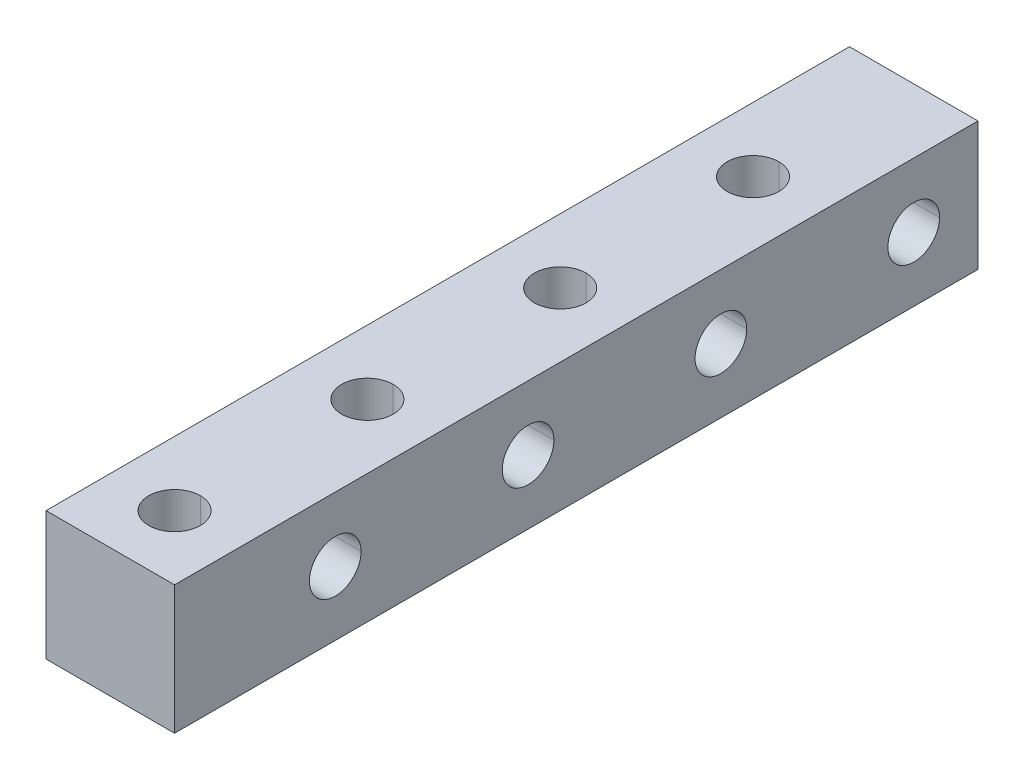
ISO-10303-21;
HEADER;
FILE_DESCRIPTION(('STEP AP214'),'2;1');
FILE_NAME('part.step','',(''),(''),'','','');
FILE_SCHEMA(('AUTOMOTIVE_DESIGN { 1 0 10303 214 1 1 1 1 }'));
ENDSEC;
DATA;
#1=APPLICATION_CONTEXT('core data for automotive mechanical design processes');
#2=APPLICATION_PROTOCOL_DEFINITION('international standard','automotive_design',2000,#1);
#3=PRODUCT_CONTEXT('',#1,'mechanical');
#4=PRODUCT('Part','Part','',(#3));
#5=PRODUCT_RELATED_PRODUCT_CATEGORY('part','',(#4));
#6=PRODUCT_DEFINITION_FORMATION('','',#4);
#7=PRODUCT_DEFINITION_CONTEXT('part definition',#1,'design');
#8=PRODUCT_DEFINITION('design','',#6,#7);
#9=PRODUCT_DEFINITION_SHAPE('','',#8);
#10=(LENGTH_UNIT() NAMED_UNIT(*) SI_UNIT(.MILLI.,.METRE.));
#11=(NAMED_UNIT(*) PLANE_ANGLE_UNIT() SI_UNIT($,.RADIAN.));
#12=(NAMED_UNIT(*) SI_UNIT($,.STERADIAN.) SOLID_ANGLE_UNIT());
#13=UNCERTAINTY_MEASURE_WITH_UNIT(LENGTH_MEASURE(1.E-05),#10,'distance_accuracy_value','');
#14=(GEOMETRIC_REPRESENTATION_CONTEXT(3) GLOBAL_UNCERTAINTY_ASSIGNED_CONTEXT((#13)) GLOBAL_UNIT_ASSIGNED_CONTEXT((#10,
#11,#12)) REPRESENTATION_CONTEXT('',''));
#15=CARTESIAN_POINT('',(0.,0.,0.));
#16=DIRECTION('',(0.,0.,1.));
#17=DIRECTION('',(1.,0.,0.));
#18=AXIS2_PLACEMENT_3D('',#15,#16,#17);
#19=CARTESIAN_POINT('',(-6.35,6.35,-79.375));
#20=DIRECTION('',(0.,0.,1.));
#21=DIRECTION('',(1.,0.,0.));
#22=AXIS2_PLACEMENT_3D('',#19,#20,#21);
#23=PLANE('',#22);
#24=DIRECTION('',(0.,-1.,0.));
#25=VECTOR('',#24,1.);
#26=CARTESIAN_POINT('',(6.35,6.35,-79.375));
#27=LINE('',#26,#25);
#28=CARTESIAN_POINT('',(6.35,6.35,-79.375));
#29=VERTEX_POINT('',#28);
#30=CARTESIAN_POINT('',(6.35,-6.35,-79.375));
#31=VERTEX_POINT('',#30);
#32=EDGE_CURVE('E287',#29,#31,#27,.T.);
#33=ORIENTED_EDGE('',*,*,#32,.T.);
#34=DIRECTION('',(1.,0.,0.));
#35=VECTOR('',#34,1.);
#36=CARTESIAN_POINT('',(-6.35,-6.35,-79.375));
#37=LINE('',#36,#35);
#38=CARTESIAN_POINT('',(-6.35,-6.35,-79.375));
#39=VERTEX_POINT('',#38);
#40=EDGE_CURVE('E254',#39,#31,#37,.T.);
#41=ORIENTED_EDGE('',*,*,#40,.F.);
#42=DIRECTION('',(0.,-1.,0.));
#43=VECTOR('',#42,1.);
#44=CARTESIAN_POINT('',(-6.35,6.35,-79.375));
#45=LINE('',#44,#43);
#46=CARTESIAN_POINT('',(-6.35,6.35,-79.375));
#47=VERTEX_POINT('',#46);
#48=EDGE_CURVE('E391',#47,#39,#45,.T.);
#49=ORIENTED_EDGE('',*,*,#48,.F.);
#50=DIRECTION('',(1.,0.,0.));
#51=VECTOR('',#50,1.);
#52=CARTESIAN_POINT('',(-6.35,6.35,-79.375));
#53=LINE('',#52,#51);
#54=EDGE_CURVE('E327',#47,#29,#53,.T.);
#55=ORIENTED_EDGE('',*,*,#54,.T.);
#56=EDGE_LOOP('',(#33,#41,#49,#55));
#57=FACE_BOUND('',#56,.T.);
#58=ADVANCED_FACE('F16',(#57),#23,.F.);
#59=CARTESIAN_POINT('',(6.35,0.,-73.025));
#60=DIRECTION('',(1.,0.,0.));
#61=DIRECTION('',(0.,0.,-1.));
#62=AXIS2_PLACEMENT_3D('',#59,#60,#61);
#63=CYLINDRICAL_SURFACE('',#62,2.5527);
#64=DIRECTION('',(1.,0.,0.));
#65=VECTOR('',#64,1.);
#66=CARTESIAN_POINT('',(6.35,0.,-70.4723));
#67=LINE('',#66,#65);
#68=CARTESIAN_POINT('',(-6.35,0.,-70.4723));
#69=VERTEX_POINT('',#68);
#70=CARTESIAN_POINT('',(6.35,0.,-70.4723));
#71=VERTEX_POINT('',#70);
#72=EDGE_CURVE('E250',#69,#71,#67,.T.);
#73=ORIENTED_EDGE('',*,*,#72,.F.);
#74=CARTESIAN_POINT('',(-6.35,0.,-73.025));
#75=DIRECTION('',(1.,0.,0.));
#76=DIRECTION('',(0.,0.,-1.));
#77=AXIS2_PLACEMENT_3D('',#74,#75,#76);
#78=CIRCLE('',#77,2.5527);
#79=CARTESIAN_POINT('',(-6.35,0.,-75.5777));
#80=VERTEX_POINT('',#79);
#81=EDGE_CURVE('E356',#80,#69,#78,.T.);
#82=ORIENTED_EDGE('',*,*,#81,.F.);
#83=DIRECTION('',(1.,0.,0.));
#84=VECTOR('',#83,1.);
#85=CARTESIAN_POINT('',(6.35,0.,-75.5777));
#86=LINE('',#85,#84);
#87=CARTESIAN_POINT('',(6.35,0.,-75.5777));
#88=VERTEX_POINT('',#87);
#89=EDGE_CURVE('E249',#80,#88,#86,.T.);
#90=ORIENTED_EDGE('',*,*,#89,.T.);
#91=CARTESIAN_POINT('',(6.35,0.,-73.025));
#92=DIRECTION('',(1.,0.,0.));
#93=DIRECTION('',(0.,0.,-1.));
#94=AXIS2_PLACEMENT_3D('',#91,#92,#93);
#95=CIRCLE('',#94,2.5527);
#96=EDGE_CURVE('E339',#88,#71,#95,.T.);
#97=ORIENTED_EDGE('',*,*,#96,.T.);
#98=EDGE_LOOP('',(#73,#82,#90,#97));
#99=FACE_BOUND('',#98,.T.);
#100=ADVANCED_FACE('F676',(#99),#63,.F.);
#101=CARTESIAN_POINT('',(6.35,0.,-53.975));
#102=DIRECTION('',(1.,0.,0.));
#103=DIRECTION('',(0.,0.,-1.));
#104=AXIS2_PLACEMENT_3D('',#101,#102,#103);
#105=CYLINDRICAL_SURFACE('',#104,2.5527);
#106=DIRECTION('',(1.,0.,0.));
#107=VECTOR('',#106,1.);
#108=CARTESIAN_POINT('',(6.35,0.,-51.4223));
#109=LINE('',#108,#107);
#110=CARTESIAN_POINT('',(-6.35,0.,-51.4223));
#111=VERTEX_POINT('',#110);
#112=CARTESIAN_POINT('',(6.35,0.,-51.4223));
#113=VERTEX_POINT('',#112);
#114=EDGE_CURVE('E241',#111,#113,#109,.T.);
#115=ORIENTED_EDGE('',*,*,#114,.F.);
#116=CARTESIAN_POINT('',(-6.35,0.,-53.975));
#117=DIRECTION('',(1.,0.,0.));
#118=DIRECTION('',(0.,0.,-1.));
#119=AXIS2_PLACEMENT_3D('',#116,#117,#118);
#120=CIRCLE('',#119,2.5527);
#121=CARTESIAN_POINT('',(-6.35,0.,-56.5277));
#122=VERTEX_POINT('',#121);
#123=EDGE_CURVE('E353',#122,#111,#120,.T.);
#124=ORIENTED_EDGE('',*,*,#123,.F.);
#125=DIRECTION('',(1.,0.,0.));
#126=VECTOR('',#125,1.);
#127=CARTESIAN_POINT('',(6.35,0.,-56.5277));
#128=LINE('',#127,#126);
#129=CARTESIAN_POINT('',(6.35,0.,-56.5277));
#130=VERTEX_POINT('',#129);
#131=EDGE_CURVE('E240',#122,#130,#128,.T.);
#132=ORIENTED_EDGE('',*,*,#131,.T.);
#133=CARTESIAN_POINT('',(6.35,0.,-53.975));
#134=DIRECTION('',(1.,0.,0.));
#135=DIRECTION('',(0.,0.,-1.));
#136=AXIS2_PLACEMENT_3D('',#133,#134,#135);
#137=CIRCLE('',#136,2.5527);
#138=EDGE_CURVE('E204',#130,#113,#137,.T.);
#139=ORIENTED_EDGE('',*,*,#138,.T.);
#140=EDGE_LOOP('',(#115,#124,#132,#139));
#141=FACE_BOUND('',#140,.T.);
#142=ADVANCED_FACE('F672',(#141),#105,.F.);
#143=CARTESIAN_POINT('',(6.35,0.,-34.925));
#144=DIRECTION('',(1.,0.,0.));
#145=DIRECTION('',(0.,0.,-1.));
#146=AXIS2_PLACEMENT_3D('',#143,#144,#145);
#147=CYLINDRICAL_SURFACE('',#146,2.5527);
#148=DIRECTION('',(1.,0.,0.));
#149=VECTOR('',#148,1.);
#150=CARTESIAN_POINT('',(6.35,0.,-32.3723));
#151=LINE('',#150,#149);
#152=CARTESIAN_POINT('',(-6.35,0.,-32.3723));
#153=VERTEX_POINT('',#152);
#154=CARTESIAN_POINT('',(6.35,0.,-32.3723));
#155=VERTEX_POINT('',#154);
#156=EDGE_CURVE('E217',#153,#155,#151,.T.);
#157=ORIENTED_EDGE('',*,*,#156,.F.);
#158=CARTESIAN_POINT('',(-6.35,0.,-34.925));
#159=DIRECTION('',(1.,0.,0.));
#160=DIRECTION('',(0.,0.,-1.));
#161=AXIS2_PLACEMENT_3D('',#158,#159,#160);
#162=CIRCLE('',#161,2.5527);
#163=CARTESIAN_POINT('',(-6.35,0.,-37.4777));
#164=VERTEX_POINT('',#163);
#165=EDGE_CURVE('E209',#164,#153,#162,.T.);
#166=ORIENTED_EDGE('',*,*,#165,.F.);
#167=DIRECTION('',(1.,0.,0.));
#168=VECTOR('',#167,1.);
#169=CARTESIAN_POINT('',(6.35,0.,-37.4777));
#170=LINE('',#169,#168);
#171=CARTESIAN_POINT('',(6.35,0.,-37.4777));
#172=VERTEX_POINT('',#171);
#173=EDGE_CURVE('E207',#164,#172,#170,.T.);
#174=ORIENTED_EDGE('',*,*,#173,.T.);
#175=CARTESIAN_POINT('',(6.35,0.,-34.925));
#176=DIRECTION('',(1.,0.,0.));
#177=DIRECTION('',(0.,0.,-1.));
#178=AXIS2_PLACEMENT_3D('',#175,#176,#177);
#179=CIRCLE('',#178,2.5527);
#180=EDGE_CURVE('E27',#172,#155,#179,.T.);
#181=ORIENTED_EDGE('',*,*,#180,.T.);
#182=EDGE_LOOP('',(#157,#166,#174,#181));
#183=FACE_BOUND('',#182,.T.);
#184=ADVANCED_FACE('F208',(#183),#147,.F.);
#185=CARTESIAN_POINT('',(0.,6.35,-63.5));
#186=DIRECTION('',(0.,1.,0.));
#187=DIRECTION('',(0.,0.,1.));
#188=AXIS2_PLACEMENT_3D('',#185,#186,#187);
#189=CYLINDRICAL_SURFACE('',#188,2.5527);
#190=DIRECTION('',(0.,1.,0.));
#191=VECTOR('',#190,1.);
#192=CARTESIAN_POINT('',(0.,6.35,-66.0527));
#193=LINE('',#192,#191);
#194=CARTESIAN_POINT('',(0.,-6.35,-66.0527));
#195=VERTEX_POINT('',#194);
#196=CARTESIAN_POINT('',(0.,6.35,-66.0527));
#197=VERTEX_POINT('',#196);
#198=EDGE_CURVE('E368',#195,#197,#193,.T.);
#199=ORIENTED_EDGE('',*,*,#198,.F.);
#200=CARTESIAN_POINT('',(0.,-6.35,-63.5));
#201=DIRECTION('',(0.,1.,0.));
#202=DIRECTION('',(0.,0.,1.));
#203=AXIS2_PLACEMENT_3D('',#200,#201,#202);
#204=CIRCLE('',#203,2.5527);
#205=CARTESIAN_POINT('',(0.,-6.35,-60.9473));
#206=VERTEX_POINT('',#205);
#207=EDGE_CURVE('E313',#206,#195,#204,.T.);
#208=ORIENTED_EDGE('',*,*,#207,.F.);
#209=DIRECTION('',(0.,1.,0.));
#210=VECTOR('',#209,1.);
#211=CARTESIAN_POINT('',(0.,6.35,-60.9473));
#212=LINE('',#211,#210);
#213=CARTESIAN_POINT('',(0.,6.35,-60.9473));
#214=VERTEX_POINT('',#213);
#215=EDGE_CURVE('E20',#206,#214,#212,.T.);
#216=ORIENTED_EDGE('',*,*,#215,.T.);
#217=CARTESIAN_POINT('',(0.,6.35,-63.5));
#218=DIRECTION('',(0.,1.,0.));
#219=DIRECTION('',(0.,0.,1.));
#220=AXIS2_PLACEMENT_3D('',#217,#218,#219);
#221=CIRCLE('',#220,2.5527);
#222=EDGE_CURVE('E306',#214,#197,#221,.T.);
#223=ORIENTED_EDGE('',*,*,#222,.T.);
#224=EDGE_LOOP('',(#199,#208,#216,#223));
#225=FACE_BOUND('',#224,.T.);
#226=ADVANCED_FACE('F457',(#225),#189,.F.);
#227=CARTESIAN_POINT('',(0.,6.35,-44.45));
#228=DIRECTION('',(0.,1.,0.));
#229=DIRECTION('',(0.,0.,1.));
#230=AXIS2_PLACEMENT_3D('',#227,#228,#229);
#231=CYLINDRICAL_SURFACE('',#230,2.5527);
#232=DIRECTION('',(0.,1.,0.));
#233=VECTOR('',#232,1.);
#234=CARTESIAN_POINT('',(0.,6.35,-47.0027));
#235=LINE('',#234,#233);
#236=CARTESIAN_POINT('',(0.,-6.35,-47.0027));
#237=VERTEX_POINT('',#236);
#238=CARTESIAN_POINT('',(0.,6.35,-47.0027));
#239=VERTEX_POINT('',#238);
#240=EDGE_CURVE('E276',#237,#239,#235,.T.);
#241=ORIENTED_EDGE('',*,*,#240,.F.);
#242=CARTESIAN_POINT('',(0.,-6.35,-44.45));
#243=DIRECTION('',(0.,1.,0.));
#244=DIRECTION('',(0.,0.,1.));
#245=AXIS2_PLACEMENT_3D('',#242,#243,#244);
#246=CIRCLE('',#245,2.5527);
#247=CARTESIAN_POINT('',(0.,-6.35,-41.8973));
#248=VERTEX_POINT('',#247);
#249=EDGE_CURVE('E312',#248,#237,#246,.T.);
#250=ORIENTED_EDGE('',*,*,#249,.F.);
#251=DIRECTION('',(0.,1.,0.));
#252=VECTOR('',#251,1.);
#253=CARTESIAN_POINT('',(0.,6.35,-41.8973));
#254=LINE('',#253,#252);
#255=CARTESIAN_POINT('',(0.,6.35,-41.8973));
#256=VERTEX_POINT('',#255);
#257=EDGE_CURVE('E365',#248,#256,#254,.T.);
#258=ORIENTED_EDGE('',*,*,#257,.T.);
#259=CARTESIAN_POINT('',(0.,6.35,-44.45));
#260=DIRECTION('',(0.,1.,0.));
#261=DIRECTION('',(0.,0.,1.));
#262=AXIS2_PLACEMENT_3D('',#259,#260,#261);
#263=CIRCLE('',#262,2.5527);
#264=EDGE_CURVE('E295',#256,#239,#263,.T.);
#265=ORIENTED_EDGE('',*,*,#264,.T.);
#266=EDGE_LOOP('',(#241,#250,#258,#265));
#267=FACE_BOUND('',#266,.T.);
#268=ADVANCED_FACE('F667',(#267),#231,.F.);
#269=CARTESIAN_POINT('',(0.,6.35,-25.4));
#270=DIRECTION('',(0.,1.,0.));
#271=DIRECTION('',(0.,0.,1.));
#272=AXIS2_PLACEMENT_3D('',#269,#270,#271);
#273=CYLINDRICAL_SURFACE('',#272,2.5527);
#274=DIRECTION('',(0.,1.,0.));
#275=VECTOR('',#274,1.);
#276=CARTESIAN_POINT('',(0.,6.35,-27.9527));
#277=LINE('',#276,#275);
#278=CARTESIAN_POINT('',(0.,-6.35,-27.9527));
#279=VERTEX_POINT('',#278);
#280=CARTESIAN_POINT('',(0.,6.35,-27.9527));
#281=VERTEX_POINT('',#280);
#282=EDGE_CURVE('E340',#279,#281,#277,.T.);
#283=ORIENTED_EDGE('',*,*,#282,.F.);
#284=CARTESIAN_POINT('',(0.,-6.35,-25.4));
#285=DIRECTION('',(0.,1.,0.));
#286=DIRECTION('',(0.,0.,1.));
#287=AXIS2_PLACEMENT_3D('',#284,#285,#286);
#288=CIRCLE('',#287,2.5527);
#289=CARTESIAN_POINT('',(0.,-6.35,-22.8473));
#290=VERTEX_POINT('',#289);
#291=EDGE_CURVE('E314',#290,#279,#288,.T.);
#292=ORIENTED_EDGE('',*,*,#291,.F.);
#293=DIRECTION('',(0.,1.,0.));
#294=VECTOR('',#293,1.);
#295=CARTESIAN_POINT('',(0.,6.35,-22.8473));
#296=LINE('',#295,#294);
#297=CARTESIAN_POINT('',(0.,6.35,-22.8473));
#298=VERTEX_POINT('',#297);
#299=EDGE_CURVE('E284',#290,#298,#296,.T.);
#300=ORIENTED_EDGE('',*,*,#299,.T.);
#301=CARTESIAN_POINT('',(0.,6.35,-25.4));
#302=DIRECTION('',(0.,1.,0.));
#303=DIRECTION('',(0.,0.,1.));
#304=AXIS2_PLACEMENT_3D('',#301,#302,#303);
#305=CIRCLE('',#304,2.5527);
#306=EDGE_CURVE('E288',#298,#281,#305,.T.);
#307=ORIENTED_EDGE('',*,*,#306,.T.);
#308=EDGE_LOOP('',(#283,#292,#300,#307));
#309=FACE_BOUND('',#308,.T.);
#310=ADVANCED_FACE('F726',(#309),#273,.F.);
#311=CARTESIAN_POINT('',(6.35,0.,-15.875));
#312=DIRECTION('',(1.,0.,0.));
#313=DIRECTION('',(0.,0.,-1.));
#314=AXIS2_PLACEMENT_3D('',#311,#312,#313);
#315=CYLINDRICAL_SURFACE('',#314,2.5527);
#316=DIRECTION('',(1.,0.,0.));
#317=VECTOR('',#316,1.);
#318=CARTESIAN_POINT('',(6.35,0.,-13.3223));
#319=LINE('',#318,#317);
#320=CARTESIAN_POINT('',(-6.35,0.,-13.3223));
#321=VERTEX_POINT('',#320);
#322=CARTESIAN_POINT('',(6.35,0.,-13.3223));
#323=VERTEX_POINT('',#322);
#324=EDGE_CURVE('E275',#321,#323,#319,.T.);
#325=ORIENTED_EDGE('',*,*,#324,.F.);
#326=CARTESIAN_POINT('',(-6.35,0.,-15.875));
#327=DIRECTION('',(1.,0.,0.));
#328=DIRECTION('',(0.,0.,-1.));
#329=AXIS2_PLACEMENT_3D('',#326,#327,#328);
#330=CIRCLE('',#329,2.5527);
#331=CARTESIAN_POINT('',(-6.35,0.,-18.4277));
#332=VERTEX_POINT('',#331);
#333=EDGE_CURVE('E370',#332,#321,#330,.T.);
#334=ORIENTED_EDGE('',*,*,#333,.F.);
#335=DIRECTION('',(1.,0.,0.));
#336=VECTOR('',#335,1.);
#337=CARTESIAN_POINT('',(6.35,0.,-18.4277));
#338=LINE('',#337,#336);
#339=CARTESIAN_POINT('',(6.35,0.,-18.4277));
#340=VERTEX_POINT('',#339);
#341=EDGE_CURVE('E245',#332,#340,#338,.T.);
#342=ORIENTED_EDGE('',*,*,#341,.T.);
#343=CARTESIAN_POINT('',(6.35,0.,-15.875));
#344=DIRECTION('',(1.,0.,0.));
#345=DIRECTION('',(0.,0.,-1.));
#346=AXIS2_PLACEMENT_3D('',#343,#344,#345);
#347=CIRCLE('',#346,2.5527);
#348=EDGE_CURVE('E10',#340,#323,#347,.T.);
#349=ORIENTED_EDGE('',*,*,#348,.T.);
#350=EDGE_LOOP('',(#325,#334,#342,#349));
#351=FACE_BOUND('',#350,.T.);
#352=ADVANCED_FACE('F655',(#351),#315,.F.);
#353=CARTESIAN_POINT('',(0.,6.35,-6.35));
#354=DIRECTION('',(0.,1.,0.));
#355=DIRECTION('',(0.,0.,1.));
#356=AXIS2_PLACEMENT_3D('',#353,#354,#355);
#357=CYLINDRICAL_SURFACE('',#356,2.5527);
#358=DIRECTION('',(0.,1.,0.));
#359=VECTOR('',#358,1.);
#360=CARTESIAN_POINT('',(0.,6.35,-8.9027));
#361=LINE('',#360,#359);
#362=CARTESIAN_POINT('',(0.,-6.35,-8.9027));
#363=VERTEX_POINT('',#362);
#364=CARTESIAN_POINT('',(0.,6.35,-8.9027));
#365=VERTEX_POINT('',#364);
#366=EDGE_CURVE('E231',#363,#365,#361,.T.);
#367=ORIENTED_EDGE('',*,*,#366,.F.);
#368=CARTESIAN_POINT('',(0.,-6.35,-6.35));
#369=DIRECTION('',(0.,1.,0.));
#370=DIRECTION('',(0.,0.,1.));
#371=AXIS2_PLACEMENT_3D('',#368,#369,#370);
#372=CIRCLE('',#371,2.5527);
#373=CARTESIAN_POINT('',(0.,-6.35,-3.7973));
#374=VERTEX_POINT('',#373);
#375=EDGE_CURVE('E330',#374,#363,#372,.T.);
#376=ORIENTED_EDGE('',*,*,#375,.F.);
#377=DIRECTION('',(0.,1.,0.));
#378=VECTOR('',#377,1.);
#379=CARTESIAN_POINT('',(0.,6.35,-3.7973));
#380=LINE('',#379,#378);
#381=CARTESIAN_POINT('',(0.,6.35,-3.7973));
#382=VERTEX_POINT('',#381);
#383=EDGE_CURVE('E251',#374,#382,#380,.T.);
#384=ORIENTED_EDGE('',*,*,#383,.T.);
#385=CARTESIAN_POINT('',(0.,6.35,-6.35));
#386=DIRECTION('',(0.,1.,0.));
#387=DIRECTION('',(0.,0.,1.));
#388=AXIS2_PLACEMENT_3D('',#385,#386,#387);
#389=CIRCLE('',#388,2.5527);
#390=EDGE_CURVE('E285',#382,#365,#389,.T.);
#391=ORIENTED_EDGE('',*,*,#390,.T.);
#392=EDGE_LOOP('',(#367,#376,#384,#391));
#393=FACE_BOUND('',#392,.T.);
#394=ADVANCED_FACE('F650',(#393),#357,.F.);
#395=CARTESIAN_POINT('',(-6.35,6.35,0.));
#396=DIRECTION('',(0.,0.,1.));
#397=DIRECTION('',(1.,0.,0.));
#398=AXIS2_PLACEMENT_3D('',#395,#396,#397);
#399=PLANE('',#398);
#400=DIRECTION('',(0.,-1.,0.));
#401=VECTOR('',#400,1.);
#402=CARTESIAN_POINT('',(-6.35,-6.35,0.));
#403=LINE('',#402,#401);
#404=CARTESIAN_POINT('',(-6.35,6.35,0.));
#405=VERTEX_POINT('',#404);
#406=CARTESIAN_POINT('',(-6.35,-6.35,0.));
#407=VERTEX_POINT('',#406);
#408=EDGE_CURVE('E382',#405,#407,#403,.T.);
#409=ORIENTED_EDGE('',*,*,#408,.T.);
#410=DIRECTION('',(1.,0.,0.));
#411=VECTOR('',#410,1.);
#412=CARTESIAN_POINT('',(6.35,-6.35,0.));
#413=LINE('',#412,#411);
#414=CARTESIAN_POINT('',(6.35,-6.35,0.));
#415=VERTEX_POINT('',#414);
#416=EDGE_CURVE('E310',#407,#415,#413,.T.);
#417=ORIENTED_EDGE('',*,*,#416,.T.);
#418=DIRECTION('',(0.,1.,0.));
#419=VECTOR('',#418,1.);
#420=CARTESIAN_POINT('',(6.35,-6.35,0.));
#421=LINE('',#420,#419);
#422=CARTESIAN_POINT('',(6.35,6.35,0.));
#423=VERTEX_POINT('',#422);
#424=EDGE_CURVE('E41',#415,#423,#421,.T.);
#425=ORIENTED_EDGE('',*,*,#424,.T.);
#426=DIRECTION('',(-1.,0.,0.));
#427=VECTOR('',#426,1.);
#428=CARTESIAN_POINT('',(6.35,6.35,0.));
#429=LINE('',#428,#427);
#430=EDGE_CURVE('E323',#423,#405,#429,.T.);
#431=ORIENTED_EDGE('',*,*,#430,.T.);
#432=EDGE_LOOP('',(#409,#417,#425,#431));
#433=FACE_BOUND('',#432,.T.);
#434=ADVANCED_FACE('F644',(#433),#399,.T.);
#435=CARTESIAN_POINT('',(6.35,-6.35,-85.725));
#436=DIRECTION('',(1.,0.,0.));
#437=DIRECTION('',(0.,1.,0.));
#438=AXIS2_PLACEMENT_3D('',#435,#436,#437);
#439=PLANE('',#438);
#440=ORIENTED_EDGE('',*,*,#348,.F.);
#441=CARTESIAN_POINT('',(6.35,0.,-15.875));
#442=DIRECTION('',(1.,0.,0.));
#443=DIRECTION('',(0.,0.,-1.));
#444=AXIS2_PLACEMENT_3D('',#441,#442,#443);
#445=CIRCLE('',#444,2.5527);
#446=EDGE_CURVE('E348',#323,#340,#445,.T.);
#447=ORIENTED_EDGE('',*,*,#446,.F.);
#448=EDGE_LOOP('',(#440,#447));
#449=FACE_BOUND('',#448,.T.);
#450=ORIENTED_EDGE('',*,*,#180,.F.);
#451=CARTESIAN_POINT('',(6.35,0.,-34.925));
#452=DIRECTION('',(1.,0.,0.));
#453=DIRECTION('',(0.,0.,-1.));
#454=AXIS2_PLACEMENT_3D('',#451,#452,#453);
#455=CIRCLE('',#454,2.5527);
#456=EDGE_CURVE('E199',#155,#172,#455,.T.);
#457=ORIENTED_EDGE('',*,*,#456,.F.);
#458=EDGE_LOOP('',(#450,#457));
#459=FACE_BOUND('',#458,.T.);
#460=ORIENTED_EDGE('',*,*,#138,.F.);
#461=CARTESIAN_POINT('',(6.35,0.,-53.975));
#462=DIRECTION('',(1.,0.,0.));
#463=DIRECTION('',(0.,0.,-1.));
#464=AXIS2_PLACEMENT_3D('',#461,#462,#463);
#465=CIRCLE('',#464,2.5527);
#466=EDGE_CURVE('E236',#113,#130,#465,.T.);
#467=ORIENTED_EDGE('',*,*,#466,.F.);
#468=EDGE_LOOP('',(#460,#467));
#469=FACE_BOUND('',#468,.T.);
#470=ORIENTED_EDGE('',*,*,#96,.F.);
#471=CARTESIAN_POINT('',(6.35,0.,-73.025));
#472=DIRECTION('',(1.,0.,0.));
#473=DIRECTION('',(0.,0.,-1.));
#474=AXIS2_PLACEMENT_3D('',#471,#472,#473);
#475=CIRCLE('',#474,2.5527);
#476=EDGE_CURVE('E246',#71,#88,#475,.T.);
#477=ORIENTED_EDGE('',*,*,#476,.F.);
#478=EDGE_LOOP('',(#470,#477));
#479=FACE_BOUND('',#478,.T.);
#480=ORIENTED_EDGE('',*,*,#32,.F.);
#481=DIRECTION('',(0.,0.,1.));
#482=VECTOR('',#481,1.);
#483=CARTESIAN_POINT('',(6.35,6.35,-85.725));
#484=LINE('',#483,#482);
#485=EDGE_CURVE('E326',#29,#423,#484,.T.);
#486=ORIENTED_EDGE('',*,*,#485,.T.);
#487=ORIENTED_EDGE('',*,*,#424,.F.);
#488=DIRECTION('',(0.,0.,1.));
#489=VECTOR('',#488,1.);
#490=CARTESIAN_POINT('',(6.35,-6.35,-85.725));
#491=LINE('',#490,#489);
#492=EDGE_CURVE('E263',#31,#415,#491,.T.);
#493=ORIENTED_EDGE('',*,*,#492,.F.);
#494=EDGE_LOOP('',(#480,#486,#487,#493));
#495=FACE_BOUND('',#494,.T.);
#496=ADVANCED_FACE('F196',(#449,#459,#469,#479,#495),#439,.T.);
#497=CARTESIAN_POINT('',(6.35,6.35,-85.725));
#498=DIRECTION('',(0.,1.,0.));
#499=DIRECTION('',(1.,0.,0.));
#500=AXIS2_PLACEMENT_3D('',#497,#498,#499);
#501=PLANE('',#500);
#502=ORIENTED_EDGE('',*,*,#390,.F.);
#503=CARTESIAN_POINT('',(0.,6.35,-6.35));
#504=DIRECTION('',(0.,1.,0.));
#505=DIRECTION('',(0.,0.,1.));
#506=AXIS2_PLACEMENT_3D('',#503,#504,#505);
#507=CIRCLE('',#506,2.5527);
#508=EDGE_CURVE('E234',#365,#382,#507,.T.);
#509=ORIENTED_EDGE('',*,*,#508,.F.);
#510=EDGE_LOOP('',(#502,#509));
#511=FACE_BOUND('',#510,.T.);
#512=ORIENTED_EDGE('',*,*,#306,.F.);
#513=CARTESIAN_POINT('',(0.,6.35,-25.4));
#514=DIRECTION('',(0.,1.,0.));
#515=DIRECTION('',(0.,0.,1.));
#516=AXIS2_PLACEMENT_3D('',#513,#514,#515);
#517=CIRCLE('',#516,2.5527);
#518=EDGE_CURVE('E344',#281,#298,#517,.T.);
#519=ORIENTED_EDGE('',*,*,#518,.F.);
#520=EDGE_LOOP('',(#512,#519));
#521=FACE_BOUND('',#520,.T.);
#522=ORIENTED_EDGE('',*,*,#264,.F.);
#523=CARTESIAN_POINT('',(0.,6.35,-44.45));
#524=DIRECTION('',(0.,1.,0.));
#525=DIRECTION('',(0.,0.,1.));
#526=AXIS2_PLACEMENT_3D('',#523,#524,#525);
#527=CIRCLE('',#526,2.5527);
#528=EDGE_CURVE('E279',#239,#256,#527,.T.);
#529=ORIENTED_EDGE('',*,*,#528,.F.);
#530=EDGE_LOOP('',(#522,#529));
#531=FACE_BOUND('',#530,.T.);
#532=ORIENTED_EDGE('',*,*,#222,.F.);
#533=CARTESIAN_POINT('',(0.,6.35,-63.5));
#534=DIRECTION('',(0.,1.,0.));
#535=DIRECTION('',(0.,0.,1.));
#536=AXIS2_PLACEMENT_3D('',#533,#534,#535);
#537=CIRCLE('',#536,2.5527);
#538=EDGE_CURVE('E229',#197,#214,#537,.T.);
#539=ORIENTED_EDGE('',*,*,#538,.F.);
#540=EDGE_LOOP('',(#532,#539));
#541=FACE_BOUND('',#540,.T.);
#542=ORIENTED_EDGE('',*,*,#54,.F.);
#543=DIRECTION('',(0.,0.,1.));
#544=VECTOR('',#543,1.);
#545=CARTESIAN_POINT('',(-6.35,6.35,-85.725));
#546=LINE('',#545,#544);
#547=EDGE_CURVE('E379',#47,#405,#546,.T.);
#548=ORIENTED_EDGE('',*,*,#547,.T.);
#549=ORIENTED_EDGE('',*,*,#430,.F.);
#550=ORIENTED_EDGE('',*,*,#485,.F.);
#551=EDGE_LOOP('',(#542,#548,#549,#550));
#552=FACE_BOUND('',#551,.T.);
#553=ADVANCED_FACE('F459',(#511,#521,#531,#541,#552),#501,.T.);
#554=CARTESIAN_POINT('',(-6.35,-6.35,-85.725));
#555=DIRECTION('',(-1.,0.,0.));
#556=DIRECTION('',(0.,0.,1.));
#557=AXIS2_PLACEMENT_3D('',#554,#555,#556);
#558=PLANE('',#557);
#559=ORIENTED_EDGE('',*,*,#333,.T.);
#560=CARTESIAN_POINT('',(-6.35,0.,-15.875));
#561=DIRECTION('',(1.,0.,0.));
#562=DIRECTION('',(0.,0.,-1.));
#563=AXIS2_PLACEMENT_3D('',#560,#561,#562);
#564=CIRCLE('',#563,2.5527);
#565=EDGE_CURVE('E281',#321,#332,#564,.T.);
#566=ORIENTED_EDGE('',*,*,#565,.T.);
#567=EDGE_LOOP('',(#559,#566));
#568=FACE_BOUND('',#567,.T.);
#569=ORIENTED_EDGE('',*,*,#165,.T.);
#570=CARTESIAN_POINT('',(-6.35,0.,-34.925));
#571=DIRECTION('',(1.,0.,0.));
#572=DIRECTION('',(0.,0.,-1.));
#573=AXIS2_PLACEMENT_3D('',#570,#571,#572);
#574=CIRCLE('',#573,2.5527);
#575=EDGE_CURVE('E225',#153,#164,#574,.T.);
#576=ORIENTED_EDGE('',*,*,#575,.T.);
#577=EDGE_LOOP('',(#569,#576));
#578=FACE_BOUND('',#577,.T.);
#579=ORIENTED_EDGE('',*,*,#123,.T.);
#580=CARTESIAN_POINT('',(-6.35,0.,-53.975));
#581=DIRECTION('',(1.,0.,0.));
#582=DIRECTION('',(0.,0.,-1.));
#583=AXIS2_PLACEMENT_3D('',#580,#581,#582);
#584=CIRCLE('',#583,2.5527);
#585=EDGE_CURVE('E334',#111,#122,#584,.T.);
#586=ORIENTED_EDGE('',*,*,#585,.T.);
#587=EDGE_LOOP('',(#579,#586));
#588=FACE_BOUND('',#587,.T.);
#589=ORIENTED_EDGE('',*,*,#81,.T.);
#590=CARTESIAN_POINT('',(-6.35,0.,-73.025));
#591=DIRECTION('',(1.,0.,0.));
#592=DIRECTION('',(0.,0.,-1.));
#593=AXIS2_PLACEMENT_3D('',#590,#591,#592);
#594=CIRCLE('',#593,2.5527);
#595=EDGE_CURVE('E319',#69,#80,#594,.T.);
#596=ORIENTED_EDGE('',*,*,#595,.T.);
#597=EDGE_LOOP('',(#589,#596));
#598=FACE_BOUND('',#597,.T.);
#599=ORIENTED_EDGE('',*,*,#48,.T.);
#600=DIRECTION('',(0.,0.,1.));
#601=VECTOR('',#600,1.);
#602=CARTESIAN_POINT('',(-6.35,-6.35,-85.725));
#603=LINE('',#602,#601);
#604=EDGE_CURVE('E378',#39,#407,#603,.T.);
#605=ORIENTED_EDGE('',*,*,#604,.T.);
#606=ORIENTED_EDGE('',*,*,#408,.F.);
#607=ORIENTED_EDGE('',*,*,#547,.F.);
#608=EDGE_LOOP('',(#599,#605,#606,#607));
#609=FACE_BOUND('',#608,.T.);
#610=ADVANCED_FACE('F462',(#568,#578,#588,#598,#609),#558,.T.);
#611=CARTESIAN_POINT('',(6.35,-6.35,-85.725));
#612=DIRECTION('',(0.,-1.,0.));
#613=DIRECTION('',(0.,0.,-1.));
#614=AXIS2_PLACEMENT_3D('',#611,#612,#613);
#615=PLANE('',#614);
#616=ORIENTED_EDGE('',*,*,#207,.T.);
#617=CARTESIAN_POINT('',(0.,-6.35,-63.5));
#618=DIRECTION('',(0.,1.,0.));
#619=DIRECTION('',(0.,0.,1.));
#620=AXIS2_PLACEMENT_3D('',#617,#618,#619);
#621=CIRCLE('',#620,2.5527);
#622=EDGE_CURVE('E214',#195,#206,#621,.T.);
#623=ORIENTED_EDGE('',*,*,#622,.T.);
#624=EDGE_LOOP('',(#616,#623));
#625=FACE_BOUND('',#624,.T.);
#626=ORIENTED_EDGE('',*,*,#249,.T.);
#627=CARTESIAN_POINT('',(0.,-6.35,-44.45));
#628=DIRECTION('',(0.,1.,0.));
#629=DIRECTION('',(0.,0.,1.));
#630=AXIS2_PLACEMENT_3D('',#627,#628,#629);
#631=CIRCLE('',#630,2.5527);
#632=EDGE_CURVE('E280',#237,#248,#631,.T.);
#633=ORIENTED_EDGE('',*,*,#632,.T.);
#634=EDGE_LOOP('',(#626,#633));
#635=FACE_BOUND('',#634,.T.);
#636=ORIENTED_EDGE('',*,*,#291,.T.);
#637=CARTESIAN_POINT('',(0.,-6.35,-25.4));
#638=DIRECTION('',(0.,1.,0.));
#639=DIRECTION('',(0.,0.,1.));
#640=AXIS2_PLACEMENT_3D('',#637,#638,#639);
#641=CIRCLE('',#640,2.5527);
#642=EDGE_CURVE('E345',#279,#290,#641,.T.);
#643=ORIENTED_EDGE('',*,*,#642,.T.);
#644=EDGE_LOOP('',(#636,#643));
#645=FACE_BOUND('',#644,.T.);
#646=ORIENTED_EDGE('',*,*,#375,.T.);
#647=CARTESIAN_POINT('',(0.,-6.35,-6.35));
#648=DIRECTION('',(0.,1.,0.));
#649=DIRECTION('',(0.,0.,1.));
#650=AXIS2_PLACEMENT_3D('',#647,#648,#649);
#651=CIRCLE('',#650,2.5527);
#652=EDGE_CURVE('E235',#363,#374,#651,.T.);
#653=ORIENTED_EDGE('',*,*,#652,.T.);
#654=EDGE_LOOP('',(#646,#653));
#655=FACE_BOUND('',#654,.T.);
#656=ORIENTED_EDGE('',*,*,#40,.T.);
#657=ORIENTED_EDGE('',*,*,#492,.T.);
#658=ORIENTED_EDGE('',*,*,#416,.F.);
#659=ORIENTED_EDGE('',*,*,#604,.F.);
#660=EDGE_LOOP('',(#656,#657,#658,#659));
#661=FACE_BOUND('',#660,.T.);
#662=ADVANCED_FACE('F477',(#625,#635,#645,#655,#661),#615,.T.);
#663=CARTESIAN_POINT('',(0.,6.35,-6.35));
#664=DIRECTION('',(0.,1.,0.));
#665=DIRECTION('',(0.,0.,1.));
#666=AXIS2_PLACEMENT_3D('',#663,#664,#665);
#667=CYLINDRICAL_SURFACE('',#666,2.5527);
#668=ORIENTED_EDGE('',*,*,#652,.F.);
#669=ORIENTED_EDGE('',*,*,#366,.T.);
#670=ORIENTED_EDGE('',*,*,#508,.T.);
#671=ORIENTED_EDGE('',*,*,#383,.F.);
#672=EDGE_LOOP('',(#668,#669,#670,#671));
#673=FACE_BOUND('',#672,.T.);
#674=ADVANCED_FACE('F18',(#673),#667,.F.);
#675=CARTESIAN_POINT('',(6.35,0.,-15.875));
#676=DIRECTION('',(1.,0.,0.));
#677=DIRECTION('',(0.,0.,-1.));
#678=AXIS2_PLACEMENT_3D('',#675,#676,#677);
#679=CYLINDRICAL_SURFACE('',#678,2.5527);
#680=ORIENTED_EDGE('',*,*,#565,.F.);
#681=ORIENTED_EDGE('',*,*,#324,.T.);
#682=ORIENTED_EDGE('',*,*,#446,.T.);
#683=ORIENTED_EDGE('',*,*,#341,.F.);
#684=EDGE_LOOP('',(#680,#681,#682,#683));
#685=FACE_BOUND('',#684,.T.);
#686=ADVANCED_FACE('F688',(#685),#679,.F.);
#687=CARTESIAN_POINT('',(0.,6.35,-25.4));
#688=DIRECTION('',(0.,1.,0.));
#689=DIRECTION('',(0.,0.,1.));
#690=AXIS2_PLACEMENT_3D('',#687,#688,#689);
#691=CYLINDRICAL_SURFACE('',#690,2.5527);
#692=ORIENTED_EDGE('',*,*,#642,.F.);
#693=ORIENTED_EDGE('',*,*,#282,.T.);
#694=ORIENTED_EDGE('',*,*,#518,.T.);
#695=ORIENTED_EDGE('',*,*,#299,.F.);
#696=EDGE_LOOP('',(#692,#693,#694,#695));
#697=FACE_BOUND('',#696,.T.);
#698=ADVANCED_FACE('F627',(#697),#691,.F.);
#699=CARTESIAN_POINT('',(0.,6.35,-44.45));
#700=DIRECTION('',(0.,1.,0.));
#701=DIRECTION('',(0.,0.,1.));
#702=AXIS2_PLACEMENT_3D('',#699,#700,#701);
#703=CYLINDRICAL_SURFACE('',#702,2.5527);
#704=ORIENTED_EDGE('',*,*,#632,.F.);
#705=ORIENTED_EDGE('',*,*,#240,.T.);
#706=ORIENTED_EDGE('',*,*,#528,.T.);
#707=ORIENTED_EDGE('',*,*,#257,.F.);
#708=EDGE_LOOP('',(#704,#705,#706,#707));
#709=FACE_BOUND('',#708,.T.);
#710=ADVANCED_FACE('F619',(#709),#703,.F.);
#711=CARTESIAN_POINT('',(0.,6.35,-63.5));
#712=DIRECTION('',(0.,1.,0.));
#713=DIRECTION('',(0.,0.,1.));
#714=AXIS2_PLACEMENT_3D('',#711,#712,#713);
#715=CYLINDRICAL_SURFACE('',#714,2.5527);
#716=ORIENTED_EDGE('',*,*,#622,.F.);
#717=ORIENTED_EDGE('',*,*,#198,.T.);
#718=ORIENTED_EDGE('',*,*,#538,.T.);
#719=ORIENTED_EDGE('',*,*,#215,.F.);
#720=EDGE_LOOP('',(#716,#717,#718,#719));
#721=FACE_BOUND('',#720,.T.);
#722=ADVANCED_FACE('F456',(#721),#715,.F.);
#723=CARTESIAN_POINT('',(6.35,0.,-34.925));
#724=DIRECTION('',(1.,0.,0.));
#725=DIRECTION('',(0.,0.,-1.));
#726=AXIS2_PLACEMENT_3D('',#723,#724,#725);
#727=CYLINDRICAL_SURFACE('',#726,2.5527);
#728=ORIENTED_EDGE('',*,*,#575,.F.);
#729=ORIENTED_EDGE('',*,*,#156,.T.);
#730=ORIENTED_EDGE('',*,*,#456,.T.);
#731=ORIENTED_EDGE('',*,*,#173,.F.);
#732=EDGE_LOOP('',(#728,#729,#730,#731));
#733=FACE_BOUND('',#732,.T.);
#734=ADVANCED_FACE('F216',(#733),#727,.F.);
#735=CARTESIAN_POINT('',(6.35,0.,-53.975));
#736=DIRECTION('',(1.,0.,0.));
#737=DIRECTION('',(0.,0.,-1.));
#738=AXIS2_PLACEMENT_3D('',#735,#736,#737);
#739=CYLINDRICAL_SURFACE('',#738,2.5527);
#740=ORIENTED_EDGE('',*,*,#585,.F.);
#741=ORIENTED_EDGE('',*,*,#114,.T.);
#742=ORIENTED_EDGE('',*,*,#466,.T.);
#743=ORIENTED_EDGE('',*,*,#131,.F.);
#744=EDGE_LOOP('',(#740,#741,#742,#743));
#745=FACE_BOUND('',#744,.T.);
#746=ADVANCED_FACE('F703',(#745),#739,.F.);
#747=CARTESIAN_POINT('',(6.35,0.,-73.025));
#748=DIRECTION('',(1.,0.,0.));
#749=DIRECTION('',(0.,0.,-1.));
#750=AXIS2_PLACEMENT_3D('',#747,#748,#749);
#751=CYLINDRICAL_SURFACE('',#750,2.5527);
#752=ORIENTED_EDGE('',*,*,#595,.F.);
#753=ORIENTED_EDGE('',*,*,#72,.T.);
#754=ORIENTED_EDGE('',*,*,#476,.T.);
#755=ORIENTED_EDGE('',*,*,#89,.F.);
#756=EDGE_LOOP('',(#752,#753,#754,#755));
#757=FACE_BOUND('',#756,.T.);
#758=ADVANCED_FACE('F732',(#757),#751,.F.);
#759=CLOSED_SHELL('',(#58,#100,#142,#184,#226,#268,#310,#352,#394,#434,#496,#553,#610,#662,#674,
#686,#698,#710,#722,#734,#746,#758));
#760=MANIFOLD_SOLID_BREP('B1',#759);
#761=ADVANCED_BREP_SHAPE_REPRESENTATION('',(#18,#760),#14);
#762=SHAPE_DEFINITION_REPRESENTATION(#9,#761);
ENDSEC;
END-ISO-10303-21;
